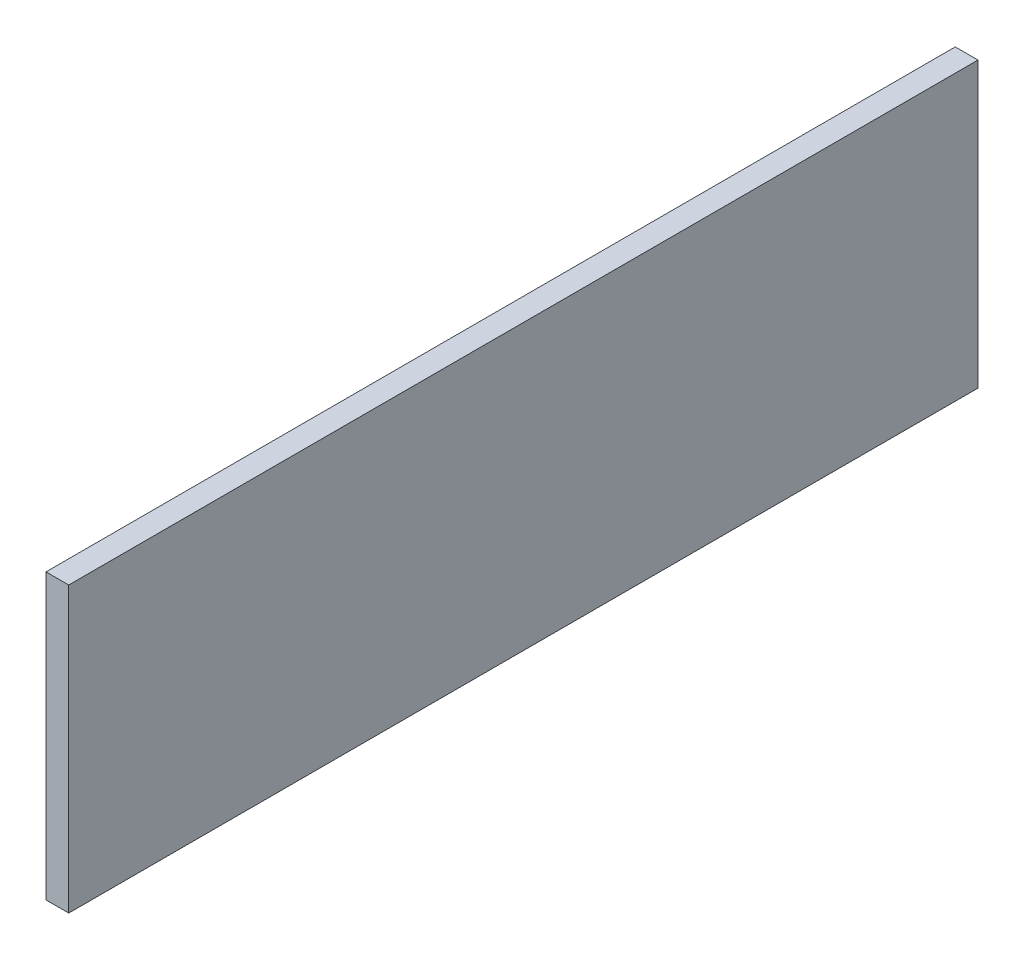
ISO-10303-21;
HEADER;
FILE_DESCRIPTION(('STEP AP214'),'2;1');
FILE_NAME('part.step','',(''),(''),'','','');
FILE_SCHEMA(('AUTOMOTIVE_DESIGN { 1 0 10303 214 1 1 1 1 }'));
ENDSEC;
DATA;
#1=APPLICATION_CONTEXT('core data for automotive mechanical design processes');
#2=APPLICATION_PROTOCOL_DEFINITION('international standard','automotive_design',2000,#1);
#3=PRODUCT_CONTEXT('',#1,'mechanical');
#4=PRODUCT('Part','Part','',(#3));
#5=PRODUCT_RELATED_PRODUCT_CATEGORY('part','',(#4));
#6=PRODUCT_DEFINITION_FORMATION('','',#4);
#7=PRODUCT_DEFINITION_CONTEXT('part definition',#1,'design');
#8=PRODUCT_DEFINITION('design','',#6,#7);
#9=PRODUCT_DEFINITION_SHAPE('','',#8);
#10=(LENGTH_UNIT() NAMED_UNIT(*) SI_UNIT(.MILLI.,.METRE.));
#11=(NAMED_UNIT(*) PLANE_ANGLE_UNIT() SI_UNIT($,.RADIAN.));
#12=(NAMED_UNIT(*) SI_UNIT($,.STERADIAN.) SOLID_ANGLE_UNIT());
#13=UNCERTAINTY_MEASURE_WITH_UNIT(LENGTH_MEASURE(1.E-05),#10,'distance_accuracy_value','');
#14=(GEOMETRIC_REPRESENTATION_CONTEXT(3) GLOBAL_UNCERTAINTY_ASSIGNED_CONTEXT((#13)) GLOBAL_UNIT_ASSIGNED_CONTEXT((#10,
#11,#12)) REPRESENTATION_CONTEXT('',''));
#15=CARTESIAN_POINT('',(0.,0.,0.));
#16=DIRECTION('',(0.,0.,1.));
#17=DIRECTION('',(1.,0.,0.));
#18=AXIS2_PLACEMENT_3D('',#15,#16,#17);
#19=CARTESIAN_POINT('',(-10.,125.,800.));
#20=DIRECTION('',(0.,1.,0.));
#21=DIRECTION('',(0.,0.,1.));
#22=AXIS2_PLACEMENT_3D('',#19,#20,#21);
#23=PLANE('',#22);
#24=DIRECTION('',(1.,0.,0.));
#25=VECTOR('',#24,1.);
#26=CARTESIAN_POINT('',(-10.,125.,0.));
#27=LINE('',#26,#25);
#28=CARTESIAN_POINT('',(-10.,125.,0.));
#29=VERTEX_POINT('',#28);
#30=CARTESIAN_POINT('',(9.99999999999999,125.,0.));
#31=VERTEX_POINT('',#30);
#32=EDGE_CURVE('E100',#29,#31,#27,.T.);
#33=ORIENTED_EDGE('',*,*,#32,.F.);
#34=DIRECTION('',(0.,0.,-1.));
#35=VECTOR('',#34,1.);
#36=CARTESIAN_POINT('',(-10.,125.,800.));
#37=LINE('',#36,#35);
#38=CARTESIAN_POINT('',(-10.,125.,800.));
#39=VERTEX_POINT('',#38);
#40=EDGE_CURVE('E11',#39,#29,#37,.T.);
#41=ORIENTED_EDGE('',*,*,#40,.F.);
#42=DIRECTION('',(1.,0.,0.));
#43=VECTOR('',#42,1.);
#44=CARTESIAN_POINT('',(-10.,125.,800.));
#45=LINE('',#44,#43);
#46=CARTESIAN_POINT('',(9.99999999999999,125.,800.));
#47=VERTEX_POINT('',#46);
#48=EDGE_CURVE('E94',#39,#47,#45,.T.);
#49=ORIENTED_EDGE('',*,*,#48,.T.);
#50=DIRECTION('',(0.,0.,-1.));
#51=VECTOR('',#50,1.);
#52=CARTESIAN_POINT('',(9.99999999999999,125.,800.));
#53=LINE('',#52,#51);
#54=EDGE_CURVE('E39',#47,#31,#53,.T.);
#55=ORIENTED_EDGE('',*,*,#54,.T.);
#56=EDGE_LOOP('',(#33,#41,#49,#55));
#57=FACE_BOUND('',#56,.T.);
#58=ADVANCED_FACE('F36',(#57),#23,.T.);
#59=CARTESIAN_POINT('',(-10.,-125.,800.));
#60=DIRECTION('',(-1.,0.,0.));
#61=DIRECTION('',(0.,0.,1.));
#62=AXIS2_PLACEMENT_3D('',#59,#60,#61);
#63=PLANE('',#62);
#64=DIRECTION('',(0.,1.,0.));
#65=VECTOR('',#64,1.);
#66=CARTESIAN_POINT('',(-10.,-125.,0.));
#67=LINE('',#66,#65);
#68=CARTESIAN_POINT('',(-10.,-125.,0.));
#69=VERTEX_POINT('',#68);
#70=EDGE_CURVE('E96',#69,#29,#67,.T.);
#71=ORIENTED_EDGE('',*,*,#70,.F.);
#72=DIRECTION('',(0.,0.,-1.));
#73=VECTOR('',#72,1.);
#74=CARTESIAN_POINT('',(-10.,-125.,800.));
#75=LINE('',#74,#73);
#76=CARTESIAN_POINT('',(-10.,-125.,800.));
#77=VERTEX_POINT('',#76);
#78=EDGE_CURVE('E45',#77,#69,#75,.T.);
#79=ORIENTED_EDGE('',*,*,#78,.F.);
#80=DIRECTION('',(0.,1.,0.));
#81=VECTOR('',#80,1.);
#82=CARTESIAN_POINT('',(-10.,-125.,800.));
#83=LINE('',#82,#81);
#84=EDGE_CURVE('E84',#77,#39,#83,.T.);
#85=ORIENTED_EDGE('',*,*,#84,.T.);
#86=ORIENTED_EDGE('',*,*,#40,.T.);
#87=EDGE_LOOP('',(#71,#79,#85,#86));
#88=FACE_BOUND('',#87,.T.);
#89=ADVANCED_FACE('F110',(#88),#63,.T.);
#90=CARTESIAN_POINT('',(-10.,-125.,800.));
#91=DIRECTION('',(0.,1.,0.));
#92=DIRECTION('',(0.,0.,1.));
#93=AXIS2_PLACEMENT_3D('',#90,#91,#92);
#94=PLANE('',#93);
#95=DIRECTION('',(1.,0.,0.));
#96=VECTOR('',#95,1.);
#97=CARTESIAN_POINT('',(-10.,-125.,0.));
#98=LINE('',#97,#96);
#99=CARTESIAN_POINT('',(9.99999999999999,-125.,0.));
#100=VERTEX_POINT('',#99);
#101=EDGE_CURVE('E89',#69,#100,#98,.T.);
#102=ORIENTED_EDGE('',*,*,#101,.T.);
#103=DIRECTION('',(0.,0.,-1.));
#104=VECTOR('',#103,1.);
#105=CARTESIAN_POINT('',(9.99999999999999,-125.,800.));
#106=LINE('',#105,#104);
#107=CARTESIAN_POINT('',(9.99999999999999,-125.,800.));
#108=VERTEX_POINT('',#107);
#109=EDGE_CURVE('E87',#108,#100,#106,.T.);
#110=ORIENTED_EDGE('',*,*,#109,.F.);
#111=DIRECTION('',(1.,0.,0.));
#112=VECTOR('',#111,1.);
#113=CARTESIAN_POINT('',(-10.,-125.,800.));
#114=LINE('',#113,#112);
#115=EDGE_CURVE('E81',#77,#108,#114,.T.);
#116=ORIENTED_EDGE('',*,*,#115,.F.);
#117=ORIENTED_EDGE('',*,*,#78,.T.);
#118=EDGE_LOOP('',(#102,#110,#116,#117));
#119=FACE_BOUND('',#118,.T.);
#120=ADVANCED_FACE('F88',(#119),#94,.F.);
#121=CARTESIAN_POINT('',(9.99999999999999,-125.,800.));
#122=DIRECTION('',(-1.,0.,0.));
#123=DIRECTION('',(0.,0.,1.));
#124=AXIS2_PLACEMENT_3D('',#121,#122,#123);
#125=PLANE('',#124);
#126=DIRECTION('',(0.,1.,0.));
#127=VECTOR('',#126,1.);
#128=CARTESIAN_POINT('',(9.99999999999999,-125.,0.));
#129=LINE('',#128,#127);
#130=EDGE_CURVE('E103',#100,#31,#129,.T.);
#131=ORIENTED_EDGE('',*,*,#130,.T.);
#132=ORIENTED_EDGE('',*,*,#54,.F.);
#133=DIRECTION('',(0.,1.,0.));
#134=VECTOR('',#133,1.);
#135=CARTESIAN_POINT('',(9.99999999999999,-125.,800.));
#136=LINE('',#135,#134);
#137=EDGE_CURVE('E78',#108,#47,#136,.T.);
#138=ORIENTED_EDGE('',*,*,#137,.F.);
#139=ORIENTED_EDGE('',*,*,#109,.T.);
#140=EDGE_LOOP('',(#131,#132,#138,#139));
#141=FACE_BOUND('',#140,.T.);
#142=ADVANCED_FACE('F93',(#141),#125,.F.);
#143=CARTESIAN_POINT('',(0.,0.,800.));
#144=DIRECTION('',(0.,0.,1.));
#145=DIRECTION('',(1.,0.,0.));
#146=AXIS2_PLACEMENT_3D('',#143,#144,#145);
#147=PLANE('',#146);
#148=ORIENTED_EDGE('',*,*,#48,.F.);
#149=ORIENTED_EDGE('',*,*,#84,.F.);
#150=ORIENTED_EDGE('',*,*,#115,.T.);
#151=ORIENTED_EDGE('',*,*,#137,.T.);
#152=EDGE_LOOP('',(#148,#149,#150,#151));
#153=FACE_BOUND('',#152,.T.);
#154=ADVANCED_FACE('F83',(#153),#147,.T.);
#155=CARTESIAN_POINT('',(0.,0.,0.));
#156=DIRECTION('',(0.,0.,1.));
#157=DIRECTION('',(1.,0.,0.));
#158=AXIS2_PLACEMENT_3D('',#155,#156,#157);
#159=PLANE('',#158);
#160=ORIENTED_EDGE('',*,*,#32,.T.);
#161=ORIENTED_EDGE('',*,*,#130,.F.);
#162=ORIENTED_EDGE('',*,*,#101,.F.);
#163=ORIENTED_EDGE('',*,*,#70,.T.);
#164=EDGE_LOOP('',(#160,#161,#162,#163));
#165=FACE_BOUND('',#164,.T.);
#166=ADVANCED_FACE('F109',(#165),#159,.F.);
#167=CLOSED_SHELL('',(#58,#89,#120,#142,#154,#166));
#168=MANIFOLD_SOLID_BREP('B2',#167);
#169=ADVANCED_BREP_SHAPE_REPRESENTATION('',(#18,#168),#14);
#170=SHAPE_DEFINITION_REPRESENTATION(#9,#169);
ENDSEC;
END-ISO-10303-21;
